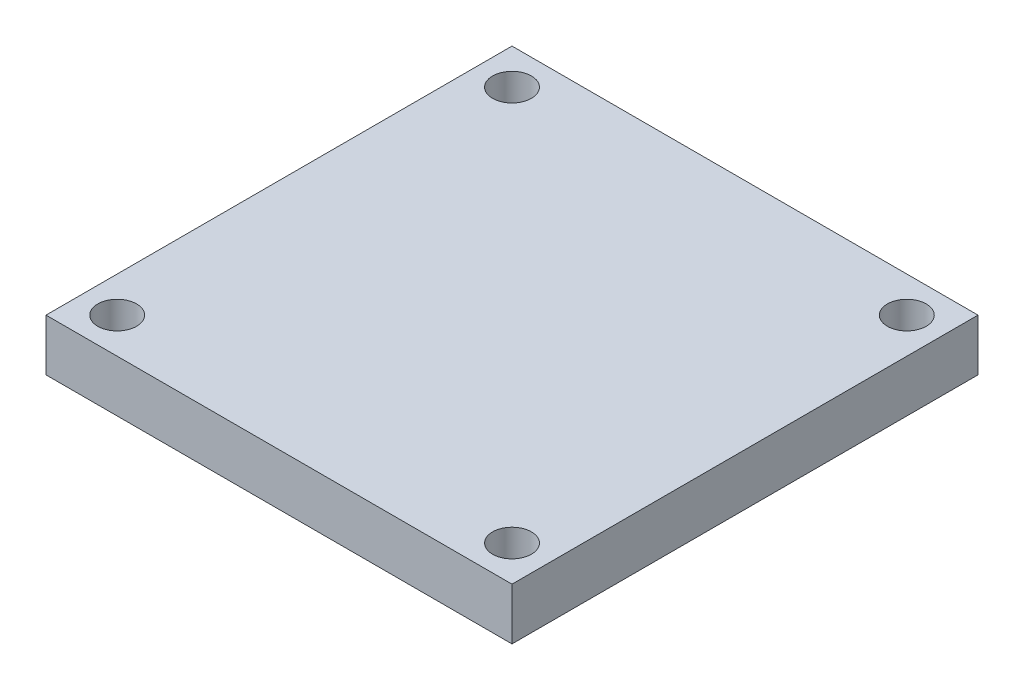
ISO-10303-21;
HEADER;
FILE_DESCRIPTION(('STEP AP214'),'2;1');
FILE_NAME('part.step','',(''),(''),'','','');
FILE_SCHEMA(('AUTOMOTIVE_DESIGN { 1 0 10303 214 1 1 1 1 }'));
ENDSEC;
DATA;
#1=APPLICATION_CONTEXT('core data for automotive mechanical design processes');
#2=APPLICATION_PROTOCOL_DEFINITION('international standard','automotive_design',2000,#1);
#3=PRODUCT_CONTEXT('',#1,'mechanical');
#4=PRODUCT('Part','Part','',(#3));
#5=PRODUCT_RELATED_PRODUCT_CATEGORY('part','',(#4));
#6=PRODUCT_DEFINITION_FORMATION('','',#4);
#7=PRODUCT_DEFINITION_CONTEXT('part definition',#1,'design');
#8=PRODUCT_DEFINITION('design','',#6,#7);
#9=PRODUCT_DEFINITION_SHAPE('','',#8);
#10=(LENGTH_UNIT() NAMED_UNIT(*) SI_UNIT(.MILLI.,.METRE.));
#11=(NAMED_UNIT(*) PLANE_ANGLE_UNIT() SI_UNIT($,.RADIAN.));
#12=(NAMED_UNIT(*) SI_UNIT($,.STERADIAN.) SOLID_ANGLE_UNIT());
#13=UNCERTAINTY_MEASURE_WITH_UNIT(LENGTH_MEASURE(1.E-05),#10,'distance_accuracy_value','');
#14=(GEOMETRIC_REPRESENTATION_CONTEXT(3) GLOBAL_UNCERTAINTY_ASSIGNED_CONTEXT((#13)) GLOBAL_UNIT_ASSIGNED_CONTEXT((#10,
#11,#12)) REPRESENTATION_CONTEXT('',''));
#15=CARTESIAN_POINT('',(0.,0.,0.));
#16=DIRECTION('',(0.,0.,1.));
#17=DIRECTION('',(1.,0.,0.));
#18=AXIS2_PLACEMENT_3D('',#15,#16,#17);
#19=CARTESIAN_POINT('',(-18.,4.,18.));
#20=DIRECTION('',(1.,0.,0.));
#21=DIRECTION('',(0.,0.,-1.));
#22=AXIS2_PLACEMENT_3D('',#19,#20,#21);
#23=PLANE('',#22);
#24=DIRECTION('',(0.,0.,1.));
#25=VECTOR('',#24,1.);
#26=CARTESIAN_POINT('',(-18.,0.,18.));
#27=LINE('',#26,#25);
#28=CARTESIAN_POINT('',(-18.,0.,-18.));
#29=VERTEX_POINT('',#28);
#30=CARTESIAN_POINT('',(-18.,0.,18.));
#31=VERTEX_POINT('',#30);
#32=EDGE_CURVE('E98',#29,#31,#27,.T.);
#33=ORIENTED_EDGE('',*,*,#32,.T.);
#34=DIRECTION('',(0.,-1.,0.));
#35=VECTOR('',#34,1.);
#36=CARTESIAN_POINT('',(-18.,4.,18.));
#37=LINE('',#36,#35);
#38=CARTESIAN_POINT('',(-18.,4.,18.));
#39=VERTEX_POINT('',#38);
#40=EDGE_CURVE('E11',#39,#31,#37,.T.);
#41=ORIENTED_EDGE('',*,*,#40,.F.);
#42=DIRECTION('',(0.,0.,1.));
#43=VECTOR('',#42,1.);
#44=CARTESIAN_POINT('',(-18.,4.,18.));
#45=LINE('',#44,#43);
#46=CARTESIAN_POINT('',(-18.,4.,-18.));
#47=VERTEX_POINT('',#46);
#48=EDGE_CURVE('E86',#47,#39,#45,.T.);
#49=ORIENTED_EDGE('',*,*,#48,.F.);
#50=DIRECTION('',(0.,-1.,0.));
#51=VECTOR('',#50,1.);
#52=CARTESIAN_POINT('',(-18.,4.,-18.));
#53=LINE('',#52,#51);
#54=EDGE_CURVE('E94',#47,#29,#53,.T.);
#55=ORIENTED_EDGE('',*,*,#54,.T.);
#56=EDGE_LOOP('',(#33,#41,#49,#55));
#57=FACE_BOUND('',#56,.T.);
#58=ADVANCED_FACE('F35',(#57),#23,.F.);
#59=CARTESIAN_POINT('',(18.,4.,18.));
#60=DIRECTION('',(0.,0.,-1.));
#61=DIRECTION('',(-1.,0.,0.));
#62=AXIS2_PLACEMENT_3D('',#59,#60,#61);
#63=PLANE('',#62);
#64=DIRECTION('',(1.,0.,0.));
#65=VECTOR('',#64,1.);
#66=CARTESIAN_POINT('',(18.,0.,18.));
#67=LINE('',#66,#65);
#68=CARTESIAN_POINT('',(18.,0.,18.));
#69=VERTEX_POINT('',#68);
#70=EDGE_CURVE('E90',#31,#69,#67,.T.);
#71=ORIENTED_EDGE('',*,*,#70,.T.);
#72=DIRECTION('',(0.,-1.,0.));
#73=VECTOR('',#72,1.);
#74=CARTESIAN_POINT('',(18.,4.,18.));
#75=LINE('',#74,#73);
#76=CARTESIAN_POINT('',(18.,4.,18.));
#77=VERTEX_POINT('',#76);
#78=EDGE_CURVE('E43',#77,#69,#75,.T.);
#79=ORIENTED_EDGE('',*,*,#78,.F.);
#80=DIRECTION('',(1.,0.,0.));
#81=VECTOR('',#80,1.);
#82=CARTESIAN_POINT('',(18.,4.,18.));
#83=LINE('',#82,#81);
#84=EDGE_CURVE('E81',#39,#77,#83,.T.);
#85=ORIENTED_EDGE('',*,*,#84,.F.);
#86=ORIENTED_EDGE('',*,*,#40,.T.);
#87=EDGE_LOOP('',(#71,#79,#85,#86));
#88=FACE_BOUND('',#87,.T.);
#89=ADVANCED_FACE('F89',(#88),#63,.F.);
#90=CARTESIAN_POINT('',(18.,4.,18.));
#91=DIRECTION('',(-1.,0.,0.));
#92=DIRECTION('',(0.,0.,1.));
#93=AXIS2_PLACEMENT_3D('',#90,#91,#92);
#94=PLANE('',#93);
#95=DIRECTION('',(0.,0.,-1.));
#96=VECTOR('',#95,1.);
#97=CARTESIAN_POINT('',(18.,0.,18.));
#98=LINE('',#97,#96);
#99=CARTESIAN_POINT('',(18.,0.,-18.));
#100=VERTEX_POINT('',#99);
#101=EDGE_CURVE('E68',#69,#100,#98,.T.);
#102=ORIENTED_EDGE('',*,*,#101,.T.);
#103=DIRECTION('',(0.,-1.,0.));
#104=VECTOR('',#103,1.);
#105=CARTESIAN_POINT('',(18.,4.,-18.));
#106=LINE('',#105,#104);
#107=CARTESIAN_POINT('',(18.,4.,-18.));
#108=VERTEX_POINT('',#107);
#109=EDGE_CURVE('E91',#108,#100,#106,.T.);
#110=ORIENTED_EDGE('',*,*,#109,.F.);
#111=DIRECTION('',(0.,0.,-1.));
#112=VECTOR('',#111,1.);
#113=CARTESIAN_POINT('',(18.,4.,18.));
#114=LINE('',#113,#112);
#115=EDGE_CURVE('E84',#77,#108,#114,.T.);
#116=ORIENTED_EDGE('',*,*,#115,.F.);
#117=ORIENTED_EDGE('',*,*,#78,.T.);
#118=EDGE_LOOP('',(#102,#110,#116,#117));
#119=FACE_BOUND('',#118,.T.);
#120=ADVANCED_FACE('F92',(#119),#94,.F.);
#121=CARTESIAN_POINT('',(18.,4.,-18.));
#122=DIRECTION('',(0.,0.,1.));
#123=DIRECTION('',(1.,0.,0.));
#124=AXIS2_PLACEMENT_3D('',#121,#122,#123);
#125=PLANE('',#124);
#126=DIRECTION('',(-1.,0.,0.));
#127=VECTOR('',#126,1.);
#128=CARTESIAN_POINT('',(18.,0.,-18.));
#129=LINE('',#128,#127);
#130=EDGE_CURVE('E74',#100,#29,#129,.T.);
#131=ORIENTED_EDGE('',*,*,#130,.T.);
#132=ORIENTED_EDGE('',*,*,#54,.F.);
#133=DIRECTION('',(-1.,0.,0.));
#134=VECTOR('',#133,1.);
#135=CARTESIAN_POINT('',(18.,4.,-18.));
#136=LINE('',#135,#134);
#137=EDGE_CURVE('E51',#108,#47,#136,.T.);
#138=ORIENTED_EDGE('',*,*,#137,.F.);
#139=ORIENTED_EDGE('',*,*,#109,.T.);
#140=EDGE_LOOP('',(#131,#132,#138,#139));
#141=FACE_BOUND('',#140,.T.);
#142=ADVANCED_FACE('F106',(#141),#125,.F.);
#143=CARTESIAN_POINT('',(0.,4.,0.));
#144=DIRECTION('',(0.,1.,0.));
#145=DIRECTION('',(0.,0.,1.));
#146=AXIS2_PLACEMENT_3D('',#143,#144,#145);
#147=PLANE('',#146);
#148=CARTESIAN_POINT('',(-15.25,4.,-15.25));
#149=DIRECTION('',(0.,1.,0.));
#150=DIRECTION('',(0.,0.,1.));
#151=AXIS2_PLACEMENT_3D('',#148,#149,#150);
#152=CIRCLE('',#151,1.5);
#153=CARTESIAN_POINT('',(-15.25,4.,-13.75));
#154=VERTEX_POINT('',#153);
#155=EDGE_CURVE('E132',#154,#154,#152,.T.);
#156=ORIENTED_EDGE('',*,*,#155,.F.);
#157=EDGE_LOOP('',(#156));
#158=FACE_BOUND('',#157,.T.);
#159=CARTESIAN_POINT('',(15.25,4.,-15.25));
#160=DIRECTION('',(0.,1.,0.));
#161=DIRECTION('',(0.,0.,1.));
#162=AXIS2_PLACEMENT_3D('',#159,#160,#161);
#163=CIRCLE('',#162,1.5);
#164=CARTESIAN_POINT('',(15.25,4.,-13.75));
#165=VERTEX_POINT('',#164);
#166=EDGE_CURVE('E126',#165,#165,#163,.T.);
#167=ORIENTED_EDGE('',*,*,#166,.F.);
#168=EDGE_LOOP('',(#167));
#169=FACE_BOUND('',#168,.T.);
#170=CARTESIAN_POINT('',(15.25,4.,15.25));
#171=DIRECTION('',(0.,1.,0.));
#172=DIRECTION('',(0.,0.,1.));
#173=AXIS2_PLACEMENT_3D('',#170,#171,#172);
#174=CIRCLE('',#173,1.5);
#175=CARTESIAN_POINT('',(15.25,4.,16.75));
#176=VERTEX_POINT('',#175);
#177=EDGE_CURVE('E120',#176,#176,#174,.T.);
#178=ORIENTED_EDGE('',*,*,#177,.F.);
#179=EDGE_LOOP('',(#178));
#180=FACE_BOUND('',#179,.T.);
#181=CARTESIAN_POINT('',(-15.25,4.,15.25));
#182=DIRECTION('',(0.,1.,0.));
#183=DIRECTION('',(0.,0.,1.));
#184=AXIS2_PLACEMENT_3D('',#181,#182,#183);
#185=CIRCLE('',#184,1.5);
#186=CARTESIAN_POINT('',(-15.25,4.,16.75));
#187=VERTEX_POINT('',#186);
#188=EDGE_CURVE('E114',#187,#187,#185,.T.);
#189=ORIENTED_EDGE('',*,*,#188,.F.);
#190=EDGE_LOOP('',(#189));
#191=FACE_BOUND('',#190,.T.);
#192=ORIENTED_EDGE('',*,*,#48,.T.);
#193=ORIENTED_EDGE('',*,*,#84,.T.);
#194=ORIENTED_EDGE('',*,*,#115,.T.);
#195=ORIENTED_EDGE('',*,*,#137,.T.);
#196=EDGE_LOOP('',(#192,#193,#194,#195));
#197=FACE_BOUND('',#196,.T.);
#198=ADVANCED_FACE('F82',(#158,#169,#180,#191,#197),#147,.T.);
#199=CARTESIAN_POINT('',(0.,0.,0.));
#200=DIRECTION('',(0.,1.,0.));
#201=DIRECTION('',(0.,0.,1.));
#202=AXIS2_PLACEMENT_3D('',#199,#200,#201);
#203=PLANE('',#202);
#204=CARTESIAN_POINT('',(-15.25,0.,-15.25));
#205=DIRECTION('',(0.,1.,0.));
#206=DIRECTION('',(0.,0.,1.));
#207=AXIS2_PLACEMENT_3D('',#204,#205,#206);
#208=CIRCLE('',#207,1.5);
#209=CARTESIAN_POINT('',(-15.25,0.,-13.75));
#210=VERTEX_POINT('',#209);
#211=EDGE_CURVE('E129',#210,#210,#208,.T.);
#212=ORIENTED_EDGE('',*,*,#211,.T.);
#213=EDGE_LOOP('',(#212));
#214=FACE_BOUND('',#213,.T.);
#215=CARTESIAN_POINT('',(15.25,0.,-15.25));
#216=DIRECTION('',(0.,1.,0.));
#217=DIRECTION('',(0.,0.,1.));
#218=AXIS2_PLACEMENT_3D('',#215,#216,#217);
#219=CIRCLE('',#218,1.5);
#220=CARTESIAN_POINT('',(15.25,0.,-13.75));
#221=VERTEX_POINT('',#220);
#222=EDGE_CURVE('E123',#221,#221,#219,.T.);
#223=ORIENTED_EDGE('',*,*,#222,.T.);
#224=EDGE_LOOP('',(#223));
#225=FACE_BOUND('',#224,.T.);
#226=CARTESIAN_POINT('',(15.25,0.,15.25));
#227=DIRECTION('',(0.,1.,0.));
#228=DIRECTION('',(0.,0.,1.));
#229=AXIS2_PLACEMENT_3D('',#226,#227,#228);
#230=CIRCLE('',#229,1.5);
#231=CARTESIAN_POINT('',(15.25,0.,16.75));
#232=VERTEX_POINT('',#231);
#233=EDGE_CURVE('E117',#232,#232,#230,.T.);
#234=ORIENTED_EDGE('',*,*,#233,.T.);
#235=EDGE_LOOP('',(#234));
#236=FACE_BOUND('',#235,.T.);
#237=CARTESIAN_POINT('',(-15.25,0.,15.25));
#238=DIRECTION('',(0.,1.,0.));
#239=DIRECTION('',(0.,0.,1.));
#240=AXIS2_PLACEMENT_3D('',#237,#238,#239);
#241=CIRCLE('',#240,1.5);
#242=CARTESIAN_POINT('',(-15.25,0.,16.75));
#243=VERTEX_POINT('',#242);
#244=EDGE_CURVE('E101',#243,#243,#241,.T.);
#245=ORIENTED_EDGE('',*,*,#244,.T.);
#246=EDGE_LOOP('',(#245));
#247=FACE_BOUND('',#246,.T.);
#248=ORIENTED_EDGE('',*,*,#32,.F.);
#249=ORIENTED_EDGE('',*,*,#130,.F.);
#250=ORIENTED_EDGE('',*,*,#101,.F.);
#251=ORIENTED_EDGE('',*,*,#70,.F.);
#252=EDGE_LOOP('',(#248,#249,#250,#251));
#253=FACE_BOUND('',#252,.T.);
#254=ADVANCED_FACE('F109',(#214,#225,#236,#247,#253),#203,.F.);
#255=CARTESIAN_POINT('',(-15.25,4.,15.25));
#256=DIRECTION('',(0.,1.,0.));
#257=DIRECTION('',(0.,0.,1.));
#258=AXIS2_PLACEMENT_3D('',#255,#256,#257);
#259=CYLINDRICAL_SURFACE('',#258,1.5);
#260=ORIENTED_EDGE('',*,*,#244,.F.);
#261=EDGE_LOOP('',(#260));
#262=FACE_BOUND('',#261,.T.);
#263=ORIENTED_EDGE('',*,*,#188,.T.);
#264=EDGE_LOOP('',(#263));
#265=FACE_BOUND('',#264,.T.);
#266=ADVANCED_FACE('F147',(#262,#265),#259,.F.);
#267=CARTESIAN_POINT('',(15.25,4.,15.25));
#268=DIRECTION('',(0.,1.,0.));
#269=DIRECTION('',(0.,0.,1.));
#270=AXIS2_PLACEMENT_3D('',#267,#268,#269);
#271=CYLINDRICAL_SURFACE('',#270,1.5);
#272=ORIENTED_EDGE('',*,*,#233,.F.);
#273=EDGE_LOOP('',(#272));
#274=FACE_BOUND('',#273,.T.);
#275=ORIENTED_EDGE('',*,*,#177,.T.);
#276=EDGE_LOOP('',(#275));
#277=FACE_BOUND('',#276,.T.);
#278=ADVANCED_FACE('F149',(#274,#277),#271,.F.);
#279=CARTESIAN_POINT('',(15.25,4.,-15.25));
#280=DIRECTION('',(0.,1.,0.));
#281=DIRECTION('',(0.,0.,1.));
#282=AXIS2_PLACEMENT_3D('',#279,#280,#281);
#283=CYLINDRICAL_SURFACE('',#282,1.5);
#284=ORIENTED_EDGE('',*,*,#222,.F.);
#285=EDGE_LOOP('',(#284));
#286=FACE_BOUND('',#285,.T.);
#287=ORIENTED_EDGE('',*,*,#166,.T.);
#288=EDGE_LOOP('',(#287));
#289=FACE_BOUND('',#288,.T.);
#290=ADVANCED_FACE('F156',(#286,#289),#283,.F.);
#291=CARTESIAN_POINT('',(-15.25,4.,-15.25));
#292=DIRECTION('',(0.,1.,0.));
#293=DIRECTION('',(0.,0.,1.));
#294=AXIS2_PLACEMENT_3D('',#291,#292,#293);
#295=CYLINDRICAL_SURFACE('',#294,1.5);
#296=ORIENTED_EDGE('',*,*,#211,.F.);
#297=EDGE_LOOP('',(#296));
#298=FACE_BOUND('',#297,.T.);
#299=ORIENTED_EDGE('',*,*,#155,.T.);
#300=EDGE_LOOP('',(#299));
#301=FACE_BOUND('',#300,.T.);
#302=ADVANCED_FACE('F136',(#298,#301),#295,.F.);
#303=CLOSED_SHELL('',(#58,#89,#120,#142,#198,#254,#266,#278,#290,#302));
#304=MANIFOLD_SOLID_BREP('B2',#303);
#305=ADVANCED_BREP_SHAPE_REPRESENTATION('',(#18,#304),#14);
#306=SHAPE_DEFINITION_REPRESENTATION(#9,#305);
ENDSEC;
END-ISO-10303-21;
